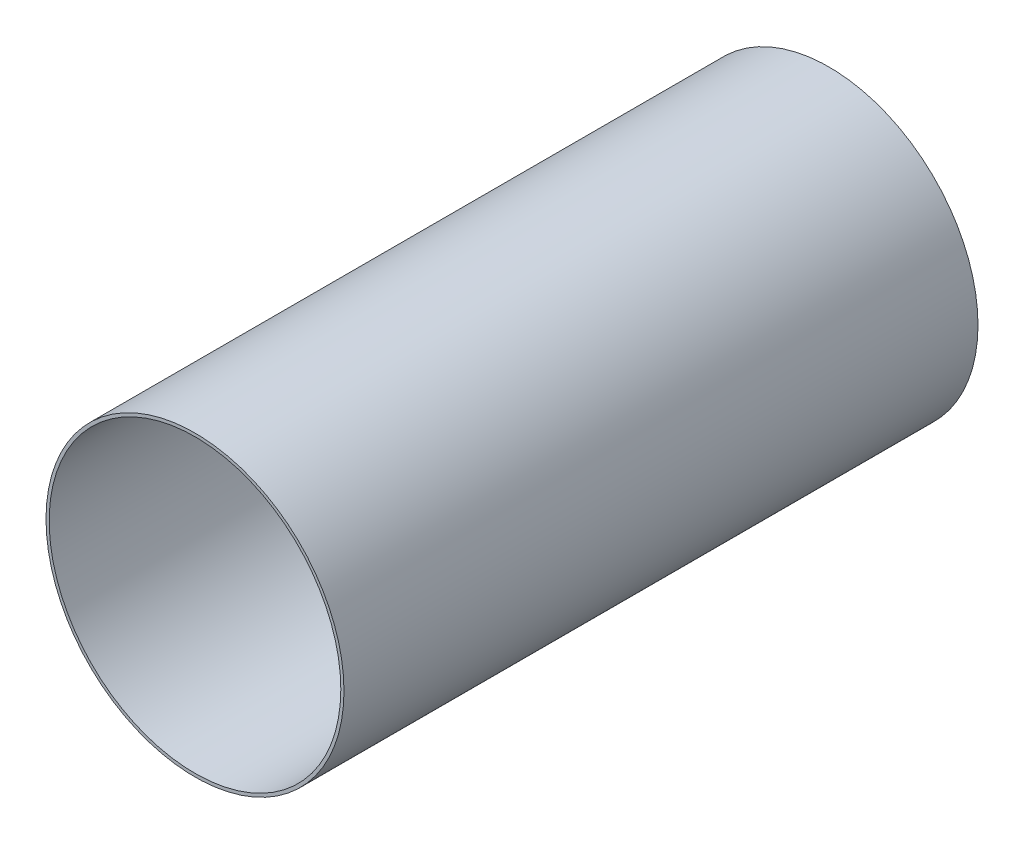
ISO-10303-21;
HEADER;
FILE_DESCRIPTION(('STEP AP214'),'2;1');
FILE_NAME('part.step','',(''),(''),'','','');
FILE_SCHEMA(('AUTOMOTIVE_DESIGN { 1 0 10303 214 1 1 1 1 }'));
ENDSEC;
DATA;
#1=APPLICATION_CONTEXT('core data for automotive mechanical design processes');
#2=APPLICATION_PROTOCOL_DEFINITION('international standard','automotive_design',2000,#1);
#3=PRODUCT_CONTEXT('',#1,'mechanical');
#4=PRODUCT('Part','Part','',(#3));
#5=PRODUCT_RELATED_PRODUCT_CATEGORY('part','',(#4));
#6=PRODUCT_DEFINITION_FORMATION('','',#4);
#7=PRODUCT_DEFINITION_CONTEXT('part definition',#1,'design');
#8=PRODUCT_DEFINITION('design','',#6,#7);
#9=PRODUCT_DEFINITION_SHAPE('','',#8);
#10=(LENGTH_UNIT() NAMED_UNIT(*) SI_UNIT(.MILLI.,.METRE.));
#11=(NAMED_UNIT(*) PLANE_ANGLE_UNIT() SI_UNIT($,.RADIAN.));
#12=(NAMED_UNIT(*) SI_UNIT($,.STERADIAN.) SOLID_ANGLE_UNIT());
#13=UNCERTAINTY_MEASURE_WITH_UNIT(LENGTH_MEASURE(1.E-05),#10,'distance_accuracy_value','');
#14=(GEOMETRIC_REPRESENTATION_CONTEXT(3) GLOBAL_UNCERTAINTY_ASSIGNED_CONTEXT((#13)) GLOBAL_UNIT_ASSIGNED_CONTEXT((#10,
#11,#12)) REPRESENTATION_CONTEXT('',''));
#15=CARTESIAN_POINT('',(0.,0.,0.));
#16=DIRECTION('',(0.,0.,1.));
#17=DIRECTION('',(1.,0.,0.));
#18=AXIS2_PLACEMENT_3D('',#15,#16,#17);
#19=CARTESIAN_POINT('',(0.,0.,100.));
#20=DIRECTION('',(0.,0.,1.));
#21=DIRECTION('',(1.,0.,0.));
#22=AXIS2_PLACEMENT_3D('',#19,#20,#21);
#23=PLANE('',#22);
#24=CARTESIAN_POINT('',(0.,0.,100.));
#25=DIRECTION('',(0.,0.,1.));
#26=DIRECTION('',(1.,0.,0.));
#27=AXIS2_PLACEMENT_3D('',#24,#25,#26);
#28=CIRCLE('',#27,23.5);
#29=CARTESIAN_POINT('',(23.5,0.,100.));
#30=VERTEX_POINT('',#29);
#31=EDGE_CURVE('E10',#30,#30,#28,.T.);
#32=ORIENTED_EDGE('',*,*,#31,.T.);
#33=EDGE_LOOP('',(#32));
#34=FACE_BOUND('',#33,.T.);
#35=CARTESIAN_POINT('',(0.,0.,100.));
#36=DIRECTION('',(0.,0.,1.));
#37=DIRECTION('',(1.,0.,0.));
#38=AXIS2_PLACEMENT_3D('',#35,#36,#37);
#39=CIRCLE('',#38,23.);
#40=CARTESIAN_POINT('',(23.,0.,100.));
#41=VERTEX_POINT('',#40);
#42=EDGE_CURVE('E41',#41,#41,#39,.T.);
#43=ORIENTED_EDGE('',*,*,#42,.F.);
#44=EDGE_LOOP('',(#43));
#45=FACE_BOUND('',#44,.T.);
#46=ADVANCED_FACE('F30',(#34,#45),#23,.T.);
#47=CARTESIAN_POINT('',(0.,0.,0.));
#48=DIRECTION('',(0.,0.,1.));
#49=DIRECTION('',(1.,0.,0.));
#50=AXIS2_PLACEMENT_3D('',#47,#48,#49);
#51=PLANE('',#50);
#52=CARTESIAN_POINT('',(0.,0.,0.));
#53=DIRECTION('',(0.,0.,1.));
#54=DIRECTION('',(1.,0.,0.));
#55=AXIS2_PLACEMENT_3D('',#52,#53,#54);
#56=CIRCLE('',#55,23.5);
#57=CARTESIAN_POINT('',(23.5,0.,0.));
#58=VERTEX_POINT('',#57);
#59=EDGE_CURVE('E34',#58,#58,#56,.T.);
#60=ORIENTED_EDGE('',*,*,#59,.F.);
#61=EDGE_LOOP('',(#60));
#62=FACE_BOUND('',#61,.T.);
#63=CARTESIAN_POINT('',(0.,0.,0.));
#64=DIRECTION('',(0.,0.,1.));
#65=DIRECTION('',(1.,0.,0.));
#66=AXIS2_PLACEMENT_3D('',#63,#64,#65);
#67=CIRCLE('',#66,23.);
#68=CARTESIAN_POINT('',(23.,0.,0.));
#69=VERTEX_POINT('',#68);
#70=EDGE_CURVE('E43',#69,#69,#67,.T.);
#71=ORIENTED_EDGE('',*,*,#70,.T.);
#72=EDGE_LOOP('',(#71));
#73=FACE_BOUND('',#72,.T.);
#74=ADVANCED_FACE('F53',(#62,#73),#51,.F.);
#75=CARTESIAN_POINT('',(0.,0.,100.));
#76=DIRECTION('',(0.,0.,-1.));
#77=DIRECTION('',(-1.,0.,0.));
#78=AXIS2_PLACEMENT_3D('',#75,#76,#77);
#79=CYLINDRICAL_SURFACE('',#78,23.5);
#80=ORIENTED_EDGE('',*,*,#31,.F.);
#81=EDGE_LOOP('',(#80));
#82=FACE_BOUND('',#81,.T.);
#83=ORIENTED_EDGE('',*,*,#59,.T.);
#84=EDGE_LOOP('',(#83));
#85=FACE_BOUND('',#84,.T.);
#86=ADVANCED_FACE('F32',(#82,#85),#79,.T.);
#87=CARTESIAN_POINT('',(0.,0.,100.));
#88=DIRECTION('',(0.,0.,-1.));
#89=DIRECTION('',(-1.,0.,0.));
#90=AXIS2_PLACEMENT_3D('',#87,#88,#89);
#91=CYLINDRICAL_SURFACE('',#90,23.);
#92=ORIENTED_EDGE('',*,*,#42,.T.);
#93=EDGE_LOOP('',(#92));
#94=FACE_BOUND('',#93,.T.);
#95=ORIENTED_EDGE('',*,*,#70,.F.);
#96=EDGE_LOOP('',(#95));
#97=FACE_BOUND('',#96,.T.);
#98=ADVANCED_FACE('F49',(#94,#97),#91,.F.);
#99=CLOSED_SHELL('',(#46,#74,#86,#98));
#100=MANIFOLD_SOLID_BREP('B2',#99);
#101=ADVANCED_BREP_SHAPE_REPRESENTATION('',(#18,#100),#14);
#102=SHAPE_DEFINITION_REPRESENTATION(#9,#101);
ENDSEC;
END-ISO-10303-21;
